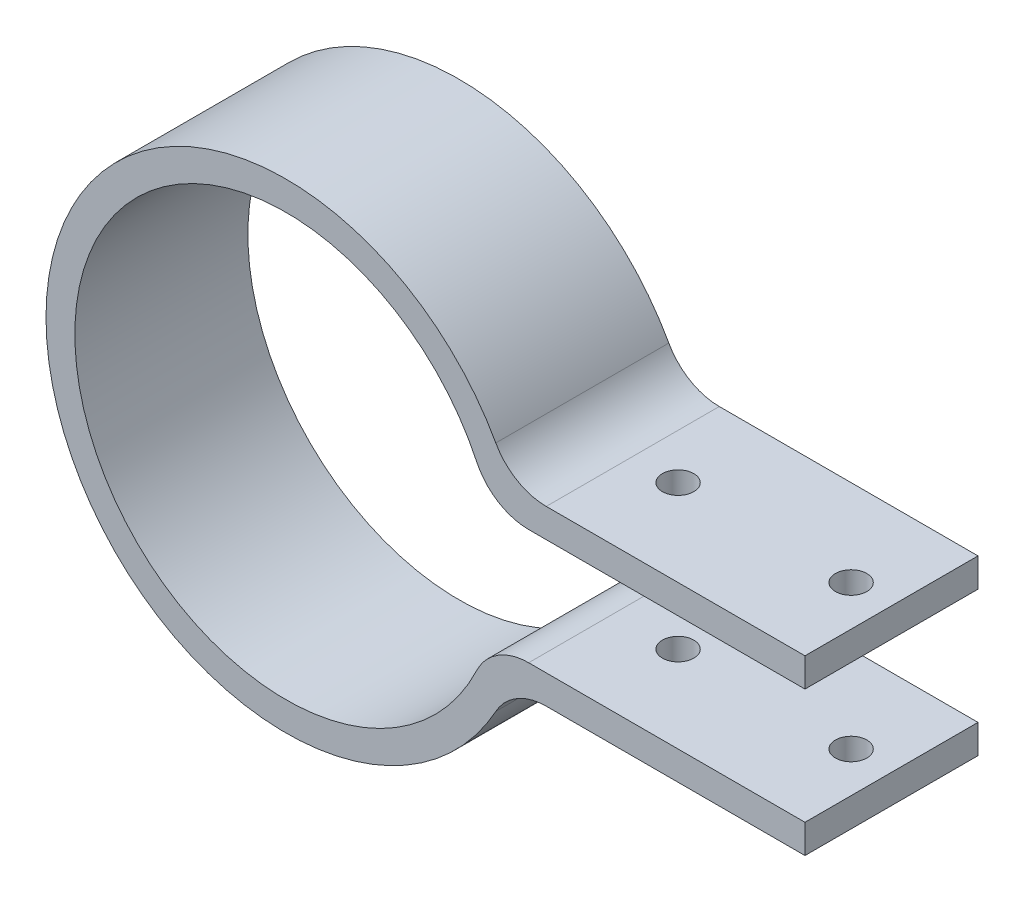
ISO-10303-21;
HEADER;
FILE_DESCRIPTION(('STEP AP214'),'2;1');
FILE_NAME('part.step','',(''),(''),'','','');
FILE_SCHEMA(('AUTOMOTIVE_DESIGN { 1 0 10303 214 1 1 1 1 }'));
ENDSEC;
DATA;
#1=APPLICATION_CONTEXT('core data for automotive mechanical design processes');
#2=APPLICATION_PROTOCOL_DEFINITION('international standard','automotive_design',2000,#1);
#3=PRODUCT_CONTEXT('',#1,'mechanical');
#4=PRODUCT('Part','Part','',(#3));
#5=PRODUCT_RELATED_PRODUCT_CATEGORY('part','',(#4));
#6=PRODUCT_DEFINITION_FORMATION('','',#4);
#7=PRODUCT_DEFINITION_CONTEXT('part definition',#1,'design');
#8=PRODUCT_DEFINITION('design','',#6,#7);
#9=PRODUCT_DEFINITION_SHAPE('','',#8);
#10=(LENGTH_UNIT() NAMED_UNIT(*) SI_UNIT(.MILLI.,.METRE.));
#11=(NAMED_UNIT(*) PLANE_ANGLE_UNIT() SI_UNIT($,.RADIAN.));
#12=(NAMED_UNIT(*) SI_UNIT($,.STERADIAN.) SOLID_ANGLE_UNIT());
#13=UNCERTAINTY_MEASURE_WITH_UNIT(LENGTH_MEASURE(1.E-05),#10,'distance_accuracy_value','');
#14=(GEOMETRIC_REPRESENTATION_CONTEXT(3) GLOBAL_UNCERTAINTY_ASSIGNED_CONTEXT((#13)) GLOBAL_UNIT_ASSIGNED_CONTEXT((#10,
#11,#12)) REPRESENTATION_CONTEXT('',''));
#15=CARTESIAN_POINT('',(0.,0.,0.));
#16=DIRECTION('',(0.,0.,1.));
#17=DIRECTION('',(1.,0.,0.));
#18=AXIS2_PLACEMENT_3D('',#15,#16,#17);
#19=CARTESIAN_POINT('',(0.,6.35,19.05));
#20=DIRECTION('',(0.,1.,0.));
#21=DIRECTION('',(0.,0.,1.));
#22=AXIS2_PLACEMENT_3D('',#19,#20,#21);
#23=PLANE('',#22);
#24=CARTESIAN_POINT('',(33.655,6.35,9.525));
#25=DIRECTION('',(0.,1.,0.));
#26=DIRECTION('',(0.,0.,1.));
#27=AXIS2_PLACEMENT_3D('',#24,#25,#26);
#28=CIRCLE('',#27,1.72719999999999);
#29=CARTESIAN_POINT('',(33.655,6.35,11.2522));
#30=VERTEX_POINT('',#29);
#31=EDGE_CURVE('E229',#30,#30,#28,.T.);
#32=ORIENTED_EDGE('',*,*,#31,.T.);
#33=EDGE_LOOP('',(#32));
#34=FACE_BOUND('',#33,.T.);
#35=CARTESIAN_POINT('',(52.705,6.35,9.525));
#36=DIRECTION('',(0.,1.,0.));
#37=DIRECTION('',(0.,0.,1.));
#38=AXIS2_PLACEMENT_3D('',#35,#36,#37);
#39=CIRCLE('',#38,1.72719999999999);
#40=CARTESIAN_POINT('',(52.705,6.35,11.2522));
#41=VERTEX_POINT('',#40);
#42=EDGE_CURVE('E170',#41,#41,#39,.T.);
#43=ORIENTED_EDGE('',*,*,#42,.T.);
#44=EDGE_LOOP('',(#43));
#45=FACE_BOUND('',#44,.T.);
#46=DIRECTION('',(1.,0.,0.));
#47=VECTOR('',#46,1.);
#48=CARTESIAN_POINT('',(0.,6.35,19.05));
#49=LINE('',#48,#47);
#50=CARTESIAN_POINT('',(26.7270888987185,6.35,19.05));
#51=VERTEX_POINT('',#50);
#52=CARTESIAN_POINT('',(57.15,6.35,19.05));
#53=VERTEX_POINT('',#52);
#54=EDGE_CURVE('E126',#51,#53,#49,.T.);
#55=ORIENTED_EDGE('',*,*,#54,.F.);
#56=DIRECTION('',(0.,0.,1.));
#57=VECTOR('',#56,1.);
#58=CARTESIAN_POINT('',(26.7270888987185,6.35,0.));
#59=LINE('',#58,#57);
#60=CARTESIAN_POINT('',(26.7270888987185,6.35,0.));
#61=VERTEX_POINT('',#60);
#62=EDGE_CURVE('E214',#51,#61,#59,.F.);
#63=ORIENTED_EDGE('',*,*,#62,.T.);
#64=DIRECTION('',(1.,0.,0.));
#65=VECTOR('',#64,1.);
#66=CARTESIAN_POINT('',(0.,6.35,0.));
#67=LINE('',#66,#65);
#68=CARTESIAN_POINT('',(57.15,6.35,0.));
#69=VERTEX_POINT('',#68);
#70=EDGE_CURVE('E140',#61,#69,#67,.T.);
#71=ORIENTED_EDGE('',*,*,#70,.T.);
#72=DIRECTION('',(0.,0.,-1.));
#73=VECTOR('',#72,1.);
#74=CARTESIAN_POINT('',(57.15,6.35,19.05));
#75=LINE('',#74,#73);
#76=EDGE_CURVE('E138',#53,#69,#75,.T.);
#77=ORIENTED_EDGE('',*,*,#76,.F.);
#78=EDGE_LOOP('',(#55,#63,#71,#77));
#79=FACE_BOUND('',#78,.T.);
#80=ADVANCED_FACE('F35',(#34,#45,#79),#23,.F.);
#81=CARTESIAN_POINT('',(57.15,0.,19.05));
#82=DIRECTION('',(1.,0.,0.));
#83=DIRECTION('',(0.,0.,-1.));
#84=AXIS2_PLACEMENT_3D('',#81,#82,#83);
#85=PLANE('',#84);
#86=DIRECTION('',(0.,-1.,0.));
#87=VECTOR('',#86,1.);
#88=CARTESIAN_POINT('',(57.15,0.,0.));
#89=LINE('',#88,#87);
#90=CARTESIAN_POINT('',(57.15,9.525,0.));
#91=VERTEX_POINT('',#90);
#92=EDGE_CURVE('E169',#91,#69,#89,.T.);
#93=ORIENTED_EDGE('',*,*,#92,.F.);
#94=DIRECTION('',(0.,0.,-1.));
#95=VECTOR('',#94,1.);
#96=CARTESIAN_POINT('',(57.15,9.525,19.05));
#97=LINE('',#96,#95);
#98=CARTESIAN_POINT('',(57.15,9.525,19.05));
#99=VERTEX_POINT('',#98);
#100=EDGE_CURVE('E145',#99,#91,#97,.T.);
#101=ORIENTED_EDGE('',*,*,#100,.F.);
#102=DIRECTION('',(0.,-1.,0.));
#103=VECTOR('',#102,1.);
#104=CARTESIAN_POINT('',(57.15,0.,19.05));
#105=LINE('',#104,#103);
#106=EDGE_CURVE('E131',#99,#53,#105,.T.);
#107=ORIENTED_EDGE('',*,*,#106,.T.);
#108=ORIENTED_EDGE('',*,*,#76,.T.);
#109=EDGE_LOOP('',(#93,#101,#107,#108));
#110=FACE_BOUND('',#109,.T.);
#111=ADVANCED_FACE('F147',(#110),#85,.T.);
#112=CARTESIAN_POINT('',(0.,9.52500000000001,19.05));
#113=DIRECTION('',(0.,-1.,0.));
#114=DIRECTION('',(1.,0.,0.));
#115=AXIS2_PLACEMENT_3D('',#112,#113,#114);
#116=PLANE('',#115);
#117=CARTESIAN_POINT('',(33.655,9.525,9.525));
#118=DIRECTION('',(0.,1.,0.));
#119=DIRECTION('',(0.,0.,1.));
#120=AXIS2_PLACEMENT_3D('',#117,#118,#119);
#121=CIRCLE('',#120,1.7272);
#122=CARTESIAN_POINT('',(33.655,9.525,11.2522));
#123=VERTEX_POINT('',#122);
#124=EDGE_CURVE('E411',#123,#123,#121,.T.);
#125=ORIENTED_EDGE('',*,*,#124,.F.);
#126=EDGE_LOOP('',(#125));
#127=FACE_BOUND('',#126,.T.);
#128=CARTESIAN_POINT('',(52.705,9.525,9.525));
#129=DIRECTION('',(0.,1.,0.));
#130=DIRECTION('',(0.,0.,1.));
#131=AXIS2_PLACEMENT_3D('',#128,#129,#130);
#132=CIRCLE('',#131,1.7272);
#133=CARTESIAN_POINT('',(52.705,9.525,11.2522));
#134=VERTEX_POINT('',#133);
#135=EDGE_CURVE('E223',#134,#134,#132,.T.);
#136=ORIENTED_EDGE('',*,*,#135,.F.);
#137=EDGE_LOOP('',(#136));
#138=FACE_BOUND('',#137,.T.);
#139=DIRECTION('',(-1.,0.,0.));
#140=VECTOR('',#139,1.);
#141=CARTESIAN_POINT('',(0.,9.52500000000001,0.));
#142=LINE('',#141,#140);
#143=CARTESIAN_POINT('',(28.6634807900227,9.525,0.));
#144=VERTEX_POINT('',#143);
#145=EDGE_CURVE('E172',#91,#144,#142,.T.);
#146=ORIENTED_EDGE('',*,*,#145,.T.);
#147=DIRECTION('',(0.,0.,1.));
#148=VECTOR('',#147,1.);
#149=CARTESIAN_POINT('',(28.6634807900227,9.525,19.05));
#150=LINE('',#149,#148);
#151=CARTESIAN_POINT('',(28.6634807900227,9.525,19.05));
#152=VERTEX_POINT('',#151);
#153=EDGE_CURVE('E52',#144,#152,#150,.T.);
#154=ORIENTED_EDGE('',*,*,#153,.T.);
#155=DIRECTION('',(-1.,0.,0.));
#156=VECTOR('',#155,1.);
#157=CARTESIAN_POINT('',(0.,9.52500000000001,19.05));
#158=LINE('',#157,#156);
#159=EDGE_CURVE('E148',#99,#152,#158,.T.);
#160=ORIENTED_EDGE('',*,*,#159,.F.);
#161=ORIENTED_EDGE('',*,*,#100,.T.);
#162=EDGE_LOOP('',(#146,#154,#160,#161));
#163=FACE_BOUND('',#162,.T.);
#164=ADVANCED_FACE('F261',(#127,#138,#163),#116,.F.);
#165=CARTESIAN_POINT('',(0.,0.,19.05));
#166=DIRECTION('',(0.,0.,-1.));
#167=DIRECTION('',(-1.,0.,0.));
#168=AXIS2_PLACEMENT_3D('',#165,#166,#167);
#169=CYLINDRICAL_SURFACE('',#168,26.416);
#170=CARTESIAN_POINT('',(0.,0.,0.));
#171=DIRECTION('',(0.,0.,1.));
#172=DIRECTION('',(1.,0.,0.));
#173=AXIS2_PLACEMENT_3D('',#170,#171,#172);
#174=CIRCLE('',#173,26.416);
#175=CARTESIAN_POINT('',(23.1085426524214,12.7984496124031,0.));
#176=VERTEX_POINT('',#175);
#177=CARTESIAN_POINT('',(23.1085426524214,-12.7984496124031,0.));
#178=VERTEX_POINT('',#177);
#179=EDGE_CURVE('E174',#176,#178,#174,.T.);
#180=ORIENTED_EDGE('',*,*,#179,.T.);
#181=DIRECTION('',(0.,0.,-1.));
#182=VECTOR('',#181,1.);
#183=CARTESIAN_POINT('',(23.1085426524214,-12.7984496124031,19.05));
#184=LINE('',#183,#182);
#185=CARTESIAN_POINT('',(23.1085426524214,-12.7984496124031,19.05));
#186=VERTEX_POINT('',#185);
#187=EDGE_CURVE('E197',#178,#186,#184,.F.);
#188=ORIENTED_EDGE('',*,*,#187,.T.);
#189=CARTESIAN_POINT('',(0.,0.,19.05));
#190=DIRECTION('',(0.,0.,1.));
#191=DIRECTION('',(1.,0.,0.));
#192=AXIS2_PLACEMENT_3D('',#189,#190,#191);
#193=CIRCLE('',#192,26.416);
#194=CARTESIAN_POINT('',(23.1085426524214,12.7984496124031,19.05));
#195=VERTEX_POINT('',#194);
#196=EDGE_CURVE('E150',#195,#186,#193,.T.);
#197=ORIENTED_EDGE('',*,*,#196,.F.);
#198=DIRECTION('',(0.,0.,-1.));
#199=VECTOR('',#198,1.);
#200=CARTESIAN_POINT('',(23.1085426524214,12.7984496124031,19.05));
#201=LINE('',#200,#199);
#202=EDGE_CURVE('E194',#195,#176,#201,.T.);
#203=ORIENTED_EDGE('',*,*,#202,.T.);
#204=EDGE_LOOP('',(#180,#188,#197,#203));
#205=FACE_BOUND('',#204,.T.);
#206=ADVANCED_FACE('F285',(#205),#169,.T.);
#207=CARTESIAN_POINT('',(0.,-9.52500000000001,19.05));
#208=DIRECTION('',(0.,-1.,0.));
#209=DIRECTION('',(1.,0.,0.));
#210=AXIS2_PLACEMENT_3D('',#207,#208,#209);
#211=PLANE('',#210);
#212=CARTESIAN_POINT('',(33.655,-9.525,9.525));
#213=DIRECTION('',(0.,-1.,0.));
#214=DIRECTION('',(1.,0.,0.));
#215=AXIS2_PLACEMENT_3D('',#212,#213,#214);
#216=CIRCLE('',#215,1.72719999999999);
#217=CARTESIAN_POINT('',(33.655,-9.525,11.2522));
#218=VERTEX_POINT('',#217);
#219=EDGE_CURVE('E234',#218,#218,#216,.T.);
#220=ORIENTED_EDGE('',*,*,#219,.F.);
#221=EDGE_LOOP('',(#220));
#222=FACE_BOUND('',#221,.T.);
#223=CARTESIAN_POINT('',(52.705,-9.525,9.525));
#224=DIRECTION('',(0.,-1.,0.));
#225=DIRECTION('',(1.,0.,0.));
#226=AXIS2_PLACEMENT_3D('',#223,#224,#225);
#227=CIRCLE('',#226,1.72719999999999);
#228=CARTESIAN_POINT('',(52.705,-9.525,11.2522));
#229=VERTEX_POINT('',#228);
#230=EDGE_CURVE('E222',#229,#229,#227,.T.);
#231=ORIENTED_EDGE('',*,*,#230,.F.);
#232=EDGE_LOOP('',(#231));
#233=FACE_BOUND('',#232,.T.);
#234=DIRECTION('',(-1.,0.,0.));
#235=VECTOR('',#234,1.);
#236=CARTESIAN_POINT('',(0.,-9.52500000000001,19.05));
#237=LINE('',#236,#235);
#238=CARTESIAN_POINT('',(57.15,-9.525,19.05));
#239=VERTEX_POINT('',#238);
#240=CARTESIAN_POINT('',(28.6634807900227,-9.525,19.05));
#241=VERTEX_POINT('',#240);
#242=EDGE_CURVE('E156',#239,#241,#237,.T.);
#243=ORIENTED_EDGE('',*,*,#242,.T.);
#244=DIRECTION('',(0.,0.,-1.));
#245=VECTOR('',#244,1.);
#246=CARTESIAN_POINT('',(28.6634807900227,-9.525,19.05));
#247=LINE('',#246,#245);
#248=CARTESIAN_POINT('',(28.6634807900227,-9.525,0.));
#249=VERTEX_POINT('',#248);
#250=EDGE_CURVE('E144',#241,#249,#247,.T.);
#251=ORIENTED_EDGE('',*,*,#250,.T.);
#252=DIRECTION('',(-1.,0.,0.));
#253=VECTOR('',#252,1.);
#254=CARTESIAN_POINT('',(0.,-9.52500000000001,0.));
#255=LINE('',#254,#253);
#256=CARTESIAN_POINT('',(57.15,-9.525,0.));
#257=VERTEX_POINT('',#256);
#258=EDGE_CURVE('E177',#257,#249,#255,.T.);
#259=ORIENTED_EDGE('',*,*,#258,.F.);
#260=DIRECTION('',(0.,0.,-1.));
#261=VECTOR('',#260,1.);
#262=CARTESIAN_POINT('',(57.15,-9.525,19.05));
#263=LINE('',#262,#261);
#264=EDGE_CURVE('E189',#239,#257,#263,.T.);
#265=ORIENTED_EDGE('',*,*,#264,.F.);
#266=EDGE_LOOP('',(#243,#251,#259,#265));
#267=FACE_BOUND('',#266,.T.);
#268=ADVANCED_FACE('F292',(#222,#233,#267),#211,.T.);
#269=CARTESIAN_POINT('',(57.15,0.,19.05));
#270=DIRECTION('',(1.,0.,0.));
#271=DIRECTION('',(0.,0.,-1.));
#272=AXIS2_PLACEMENT_3D('',#269,#270,#271);
#273=PLANE('',#272);
#274=DIRECTION('',(0.,-1.,0.));
#275=VECTOR('',#274,1.);
#276=CARTESIAN_POINT('',(57.15,0.,0.));
#277=LINE('',#276,#275);
#278=CARTESIAN_POINT('',(57.15,-6.35,0.));
#279=VERTEX_POINT('',#278);
#280=EDGE_CURVE('E180',#279,#257,#277,.T.);
#281=ORIENTED_EDGE('',*,*,#280,.F.);
#282=DIRECTION('',(0.,0.,-1.));
#283=VECTOR('',#282,1.);
#284=CARTESIAN_POINT('',(57.15,-6.35,19.05));
#285=LINE('',#284,#283);
#286=CARTESIAN_POINT('',(57.15,-6.35,19.05));
#287=VERTEX_POINT('',#286);
#288=EDGE_CURVE('E167',#287,#279,#285,.T.);
#289=ORIENTED_EDGE('',*,*,#288,.F.);
#290=DIRECTION('',(0.,-1.,0.));
#291=VECTOR('',#290,1.);
#292=CARTESIAN_POINT('',(57.15,0.,19.05));
#293=LINE('',#292,#291);
#294=EDGE_CURVE('E159',#287,#239,#293,.T.);
#295=ORIENTED_EDGE('',*,*,#294,.T.);
#296=ORIENTED_EDGE('',*,*,#264,.T.);
#297=EDGE_LOOP('',(#281,#289,#295,#296));
#298=FACE_BOUND('',#297,.T.);
#299=ADVANCED_FACE('F296',(#298),#273,.T.);
#300=CARTESIAN_POINT('',(0.,-6.35000000000001,19.05));
#301=DIRECTION('',(0.,-1.,0.));
#302=DIRECTION('',(1.,0.,0.));
#303=AXIS2_PLACEMENT_3D('',#300,#301,#302);
#304=PLANE('',#303);
#305=CARTESIAN_POINT('',(33.655,-6.35,9.525));
#306=DIRECTION('',(0.,-1.,0.));
#307=DIRECTION('',(1.,0.,0.));
#308=AXIS2_PLACEMENT_3D('',#305,#306,#307);
#309=CIRCLE('',#308,1.72719999999999);
#310=CARTESIAN_POINT('',(33.655,-6.35,11.2522));
#311=VERTEX_POINT('',#310);
#312=EDGE_CURVE('E39',#311,#311,#309,.T.);
#313=ORIENTED_EDGE('',*,*,#312,.T.);
#314=EDGE_LOOP('',(#313));
#315=FACE_BOUND('',#314,.T.);
#316=CARTESIAN_POINT('',(52.705,-6.35,9.525));
#317=DIRECTION('',(0.,-1.,0.));
#318=DIRECTION('',(1.,0.,0.));
#319=AXIS2_PLACEMENT_3D('',#316,#317,#318);
#320=CIRCLE('',#319,1.72719999999999);
#321=CARTESIAN_POINT('',(52.705,-6.35,11.2522));
#322=VERTEX_POINT('',#321);
#323=EDGE_CURVE('E220',#322,#322,#320,.T.);
#324=ORIENTED_EDGE('',*,*,#323,.T.);
#325=EDGE_LOOP('',(#324));
#326=FACE_BOUND('',#325,.T.);
#327=DIRECTION('',(-1.,0.,0.));
#328=VECTOR('',#327,1.);
#329=CARTESIAN_POINT('',(0.,-6.35000000000001,0.));
#330=LINE('',#329,#328);
#331=CARTESIAN_POINT('',(26.7270888987185,-6.35,0.));
#332=VERTEX_POINT('',#331);
#333=EDGE_CURVE('E183',#279,#332,#330,.T.);
#334=ORIENTED_EDGE('',*,*,#333,.T.);
#335=DIRECTION('',(0.,0.,1.));
#336=VECTOR('',#335,1.);
#337=CARTESIAN_POINT('',(26.7270888987185,-6.35,19.05));
#338=LINE('',#337,#336);
#339=CARTESIAN_POINT('',(26.7270888987185,-6.35,19.05));
#340=VERTEX_POINT('',#339);
#341=EDGE_CURVE('E208',#332,#340,#338,.T.);
#342=ORIENTED_EDGE('',*,*,#341,.T.);
#343=DIRECTION('',(-1.,0.,0.));
#344=VECTOR('',#343,1.);
#345=CARTESIAN_POINT('',(0.,-6.35000000000001,19.05));
#346=LINE('',#345,#344);
#347=EDGE_CURVE('E162',#287,#340,#346,.T.);
#348=ORIENTED_EDGE('',*,*,#347,.F.);
#349=ORIENTED_EDGE('',*,*,#288,.T.);
#350=EDGE_LOOP('',(#334,#342,#348,#349));
#351=FACE_BOUND('',#350,.T.);
#352=ADVANCED_FACE('F323',(#315,#326,#351),#304,.F.);
#353=CARTESIAN_POINT('',(0.,0.,19.05));
#354=DIRECTION('',(0.,0.,-1.));
#355=DIRECTION('',(-1.,0.,0.));
#356=AXIS2_PLACEMENT_3D('',#353,#354,#355);
#357=CYLINDRICAL_SURFACE('',#356,23.241);
#358=CARTESIAN_POINT('',(0.,0.,19.05));
#359=DIRECTION('',(0.,0.,1.));
#360=DIRECTION('',(1.,0.,0.));
#361=AXIS2_PLACEMENT_3D('',#358,#359,#360);
#362=CIRCLE('',#361,23.241);
#363=CARTESIAN_POINT('',(20.9916620964184,9.97467811158798,19.05));
#364=VERTEX_POINT('',#363);
#365=CARTESIAN_POINT('',(20.9916620964184,-9.97467811158799,19.05));
#366=VERTEX_POINT('',#365);
#367=EDGE_CURVE('E164',#364,#366,#362,.T.);
#368=ORIENTED_EDGE('',*,*,#367,.T.);
#369=DIRECTION('',(0.,0.,-1.));
#370=VECTOR('',#369,1.);
#371=CARTESIAN_POINT('',(20.9916620964184,-9.97467811158798,19.05));
#372=LINE('',#371,#370);
#373=CARTESIAN_POINT('',(20.9916620964184,-9.97467811158799,0.));
#374=VERTEX_POINT('',#373);
#375=EDGE_CURVE('E201',#366,#374,#372,.T.);
#376=ORIENTED_EDGE('',*,*,#375,.T.);
#377=CARTESIAN_POINT('',(0.,0.,0.));
#378=DIRECTION('',(0.,0.,1.));
#379=DIRECTION('',(1.,0.,0.));
#380=AXIS2_PLACEMENT_3D('',#377,#378,#379);
#381=CIRCLE('',#380,23.241);
#382=CARTESIAN_POINT('',(20.9916620964184,9.97467811158798,0.));
#383=VERTEX_POINT('',#382);
#384=EDGE_CURVE('E135',#383,#374,#381,.T.);
#385=ORIENTED_EDGE('',*,*,#384,.F.);
#386=DIRECTION('',(0.,0.,-1.));
#387=VECTOR('',#386,1.);
#388=CARTESIAN_POINT('',(20.9916620964184,9.97467811158798,19.05));
#389=LINE('',#388,#387);
#390=EDGE_CURVE('E199',#383,#364,#389,.F.);
#391=ORIENTED_EDGE('',*,*,#390,.T.);
#392=EDGE_LOOP('',(#368,#376,#385,#391));
#393=FACE_BOUND('',#392,.T.);
#394=ADVANCED_FACE('F304',(#393),#357,.F.);
#395=CARTESIAN_POINT('',(0.,0.,19.05));
#396=DIRECTION('',(0.,0.,1.));
#397=DIRECTION('',(1.,0.,0.));
#398=AXIS2_PLACEMENT_3D('',#395,#396,#397);
#399=PLANE('',#398);
#400=ORIENTED_EDGE('',*,*,#347,.T.);
#401=CARTESIAN_POINT('',(26.7270888987185,-12.7,19.05));
#402=DIRECTION('',(0.,0.,1.));
#403=DIRECTION('',(1.,0.,0.));
#404=AXIS2_PLACEMENT_3D('',#401,#402,#403);
#405=CIRCLE('',#404,6.35);
#406=EDGE_CURVE('E211',#340,#366,#405,.T.);
#407=ORIENTED_EDGE('',*,*,#406,.T.);
#408=ORIENTED_EDGE('',*,*,#367,.F.);
#409=CARTESIAN_POINT('',(26.7270888987185,12.7,19.05));
#410=DIRECTION('',(0.,0.,1.));
#411=DIRECTION('',(1.,0.,0.));
#412=AXIS2_PLACEMENT_3D('',#409,#410,#411);
#413=CIRCLE('',#412,6.35);
#414=EDGE_CURVE('E60',#364,#51,#413,.T.);
#415=ORIENTED_EDGE('',*,*,#414,.T.);
#416=ORIENTED_EDGE('',*,*,#54,.T.);
#417=ORIENTED_EDGE('',*,*,#106,.F.);
#418=ORIENTED_EDGE('',*,*,#159,.T.);
#419=CARTESIAN_POINT('',(28.6634807900227,15.875,19.05));
#420=DIRECTION('',(0.,0.,1.));
#421=DIRECTION('',(1.,0.,0.));
#422=AXIS2_PLACEMENT_3D('',#419,#420,#421);
#423=CIRCLE('',#422,6.35);
#424=EDGE_CURVE('E11',#152,#195,#423,.F.);
#425=ORIENTED_EDGE('',*,*,#424,.T.);
#426=ORIENTED_EDGE('',*,*,#196,.T.);
#427=CARTESIAN_POINT('',(28.6634807900227,-15.875,19.05));
#428=DIRECTION('',(0.,0.,1.));
#429=DIRECTION('',(1.,0.,0.));
#430=AXIS2_PLACEMENT_3D('',#427,#428,#429);
#431=CIRCLE('',#430,6.35);
#432=EDGE_CURVE('E218',#186,#241,#431,.F.);
#433=ORIENTED_EDGE('',*,*,#432,.T.);
#434=ORIENTED_EDGE('',*,*,#242,.F.);
#435=ORIENTED_EDGE('',*,*,#294,.F.);
#436=EDGE_LOOP('',(#400,#407,#408,#415,#416,#417,#418,#425,#426,#433,#434,#435));
#437=FACE_BOUND('',#436,.T.);
#438=ADVANCED_FACE('F129',(#437),#399,.T.);
#439=CARTESIAN_POINT('',(0.,0.,0.));
#440=DIRECTION('',(0.,0.,1.));
#441=DIRECTION('',(1.,0.,0.));
#442=AXIS2_PLACEMENT_3D('',#439,#440,#441);
#443=PLANE('',#442);
#444=ORIENTED_EDGE('',*,*,#384,.T.);
#445=CARTESIAN_POINT('',(26.7270888987185,-12.7,0.));
#446=DIRECTION('',(0.,0.,1.));
#447=DIRECTION('',(1.,0.,0.));
#448=AXIS2_PLACEMENT_3D('',#445,#446,#447);
#449=CIRCLE('',#448,6.35);
#450=EDGE_CURVE('E206',#374,#332,#449,.F.);
#451=ORIENTED_EDGE('',*,*,#450,.T.);
#452=ORIENTED_EDGE('',*,*,#333,.F.);
#453=ORIENTED_EDGE('',*,*,#280,.T.);
#454=ORIENTED_EDGE('',*,*,#258,.T.);
#455=CARTESIAN_POINT('',(28.6634807900227,-15.875,0.));
#456=DIRECTION('',(0.,0.,1.));
#457=DIRECTION('',(1.,0.,0.));
#458=AXIS2_PLACEMENT_3D('',#455,#456,#457);
#459=CIRCLE('',#458,6.35);
#460=EDGE_CURVE('E216',#249,#178,#459,.T.);
#461=ORIENTED_EDGE('',*,*,#460,.T.);
#462=ORIENTED_EDGE('',*,*,#179,.F.);
#463=CARTESIAN_POINT('',(28.6634807900227,15.875,0.));
#464=DIRECTION('',(0.,0.,1.));
#465=DIRECTION('',(1.,0.,0.));
#466=AXIS2_PLACEMENT_3D('',#463,#464,#465);
#467=CIRCLE('',#466,6.35);
#468=EDGE_CURVE('E44',#176,#144,#467,.T.);
#469=ORIENTED_EDGE('',*,*,#468,.T.);
#470=ORIENTED_EDGE('',*,*,#145,.F.);
#471=ORIENTED_EDGE('',*,*,#92,.T.);
#472=ORIENTED_EDGE('',*,*,#70,.F.);
#473=CARTESIAN_POINT('',(26.7270888987185,12.7,0.));
#474=DIRECTION('',(0.,0.,1.));
#475=DIRECTION('',(1.,0.,0.));
#476=AXIS2_PLACEMENT_3D('',#473,#474,#475);
#477=CIRCLE('',#476,6.35);
#478=EDGE_CURVE('E204',#61,#383,#477,.F.);
#479=ORIENTED_EDGE('',*,*,#478,.T.);
#480=EDGE_LOOP('',(#444,#451,#452,#453,#454,#461,#462,#469,#470,#471,#472,#479));
#481=FACE_BOUND('',#480,.T.);
#482=ADVANCED_FACE('F269',(#481),#443,.F.);
#483=CARTESIAN_POINT('',(28.6634807900227,-15.875,19.05));
#484=DIRECTION('',(0.,0.,-1.));
#485=DIRECTION('',(-1.,0.,0.));
#486=AXIS2_PLACEMENT_3D('',#483,#484,#485);
#487=CYLINDRICAL_SURFACE('',#486,6.35);
#488=ORIENTED_EDGE('',*,*,#432,.F.);
#489=ORIENTED_EDGE('',*,*,#187,.F.);
#490=ORIENTED_EDGE('',*,*,#460,.F.);
#491=ORIENTED_EDGE('',*,*,#250,.F.);
#492=EDGE_LOOP('',(#488,#489,#490,#491));
#493=FACE_BOUND('',#492,.T.);
#494=ADVANCED_FACE('F265',(#493),#487,.F.);
#495=CARTESIAN_POINT('',(26.7270888987185,-12.7,19.05));
#496=DIRECTION('',(0.,0.,-1.));
#497=DIRECTION('',(-1.,0.,0.));
#498=AXIS2_PLACEMENT_3D('',#495,#496,#497);
#499=CYLINDRICAL_SURFACE('',#498,6.35);
#500=ORIENTED_EDGE('',*,*,#406,.F.);
#501=ORIENTED_EDGE('',*,*,#341,.F.);
#502=ORIENTED_EDGE('',*,*,#450,.F.);
#503=ORIENTED_EDGE('',*,*,#375,.F.);
#504=EDGE_LOOP('',(#500,#501,#502,#503));
#505=FACE_BOUND('',#504,.T.);
#506=ADVANCED_FACE('F268',(#505),#499,.T.);
#507=CARTESIAN_POINT('',(28.6634807900227,15.875,19.05));
#508=DIRECTION('',(0.,0.,-1.));
#509=DIRECTION('',(-1.,0.,0.));
#510=AXIS2_PLACEMENT_3D('',#507,#508,#509);
#511=CYLINDRICAL_SURFACE('',#510,6.35);
#512=ORIENTED_EDGE('',*,*,#424,.F.);
#513=ORIENTED_EDGE('',*,*,#153,.F.);
#514=ORIENTED_EDGE('',*,*,#468,.F.);
#515=ORIENTED_EDGE('',*,*,#202,.F.);
#516=EDGE_LOOP('',(#512,#513,#514,#515));
#517=FACE_BOUND('',#516,.T.);
#518=ADVANCED_FACE('F272',(#517),#511,.F.);
#519=CARTESIAN_POINT('',(26.7270888987185,12.7,19.05));
#520=DIRECTION('',(0.,0.,-1.));
#521=DIRECTION('',(-1.,0.,0.));
#522=AXIS2_PLACEMENT_3D('',#519,#520,#521);
#523=CYLINDRICAL_SURFACE('',#522,6.35);
#524=ORIENTED_EDGE('',*,*,#414,.F.);
#525=ORIENTED_EDGE('',*,*,#390,.F.);
#526=ORIENTED_EDGE('',*,*,#478,.F.);
#527=ORIENTED_EDGE('',*,*,#62,.F.);
#528=EDGE_LOOP('',(#524,#525,#526,#527));
#529=FACE_BOUND('',#528,.T.);
#530=ADVANCED_FACE('F37',(#529),#523,.T.);
#531=CARTESIAN_POINT('',(52.705,9.525,9.525));
#532=DIRECTION('',(0.,1.,0.));
#533=DIRECTION('',(0.,0.,1.));
#534=AXIS2_PLACEMENT_3D('',#531,#532,#533);
#535=CYLINDRICAL_SURFACE('',#534,1.72719999999999);
#536=CARTESIAN_POINT('',(52.705,-9.525,11.2522));
#537=CARTESIAN_POINT('',(52.705,-9.49192708333333,11.2522));
#538=CARTESIAN_POINT('',(52.705,-9.45885416666666,11.2522));
#539=CARTESIAN_POINT('',(52.705,-9.39270833333333,11.2522));
#540=CARTESIAN_POINT('',(52.705,-9.35963541666666,11.2522));
#541=CARTESIAN_POINT('',(52.705,-9.29348958333333,11.2522));
#542=CARTESIAN_POINT('',(52.705,-9.26041666666666,11.2522));
#543=CARTESIAN_POINT('',(52.705,-9.19427083333333,11.2522));
#544=CARTESIAN_POINT('',(52.705,-9.16119791666667,11.2522));
#545=CARTESIAN_POINT('',(52.705,-9.09505208333333,11.2522));
#546=CARTESIAN_POINT('',(52.705,-9.06197916666666,11.2522));
#547=CARTESIAN_POINT('',(52.705,-8.99583333333333,11.2522));
#548=CARTESIAN_POINT('',(52.705,-8.96276041666666,11.2522));
#549=CARTESIAN_POINT('',(52.705,-8.89661458333333,11.2522));
#550=CARTESIAN_POINT('',(52.705,-8.86354166666666,11.2522));
#551=CARTESIAN_POINT('',(52.705,-8.79739583333333,11.2522));
#552=CARTESIAN_POINT('',(52.705,-8.76432291666666,11.2522));
#553=CARTESIAN_POINT('',(52.705,-8.69817708333333,11.2522));
#554=CARTESIAN_POINT('',(52.705,-8.66510416666666,11.2522));
#555=CARTESIAN_POINT('',(52.705,-8.59895833333333,11.2522));
#556=CARTESIAN_POINT('',(52.705,-8.56588541666667,11.2522));
#557=CARTESIAN_POINT('',(52.705,-8.49973958333333,11.2522));
#558=CARTESIAN_POINT('',(52.705,-8.46666666666666,11.2522));
#559=CARTESIAN_POINT('',(52.705,-8.40052083333333,11.2522));
#560=CARTESIAN_POINT('',(52.705,-8.36744791666666,11.2522));
#561=CARTESIAN_POINT('',(52.705,-8.30130208333333,11.2522));
#562=CARTESIAN_POINT('',(52.705,-8.26822916666666,11.2522));
#563=CARTESIAN_POINT('',(52.705,-8.20208333333333,11.2522));
#564=CARTESIAN_POINT('',(52.705,-8.16901041666666,11.2522));
#565=CARTESIAN_POINT('',(52.705,-8.10286458333333,11.2522));
#566=CARTESIAN_POINT('',(52.705,-8.06979166666667,11.2522));
#567=CARTESIAN_POINT('',(52.705,-8.00364583333333,11.2522));
#568=CARTESIAN_POINT('',(52.705,-7.97057291666667,11.2522));
#569=CARTESIAN_POINT('',(52.705,-7.90442708333333,11.2522));
#570=CARTESIAN_POINT('',(52.705,-7.87135416666666,11.2522));
#571=CARTESIAN_POINT('',(52.705,-7.80520833333333,11.2522));
#572=CARTESIAN_POINT('',(52.705,-7.77213541666667,11.2522));
#573=CARTESIAN_POINT('',(52.705,-7.70598958333333,11.2522));
#574=CARTESIAN_POINT('',(52.705,-7.67291666666667,11.2522));
#575=CARTESIAN_POINT('',(52.705,-7.60677083333333,11.2522));
#576=CARTESIAN_POINT('',(52.705,-7.57369791666667,11.2522));
#577=CARTESIAN_POINT('',(52.705,-7.50755208333333,11.2522));
#578=CARTESIAN_POINT('',(52.705,-7.47447916666667,11.2522));
#579=CARTESIAN_POINT('',(52.705,-7.40833333333333,11.2522));
#580=CARTESIAN_POINT('',(52.705,-7.37526041666667,11.2522));
#581=CARTESIAN_POINT('',(52.705,-7.30911458333333,11.2522));
#582=CARTESIAN_POINT('',(52.705,-7.27604166666667,11.2522));
#583=CARTESIAN_POINT('',(52.705,-7.20989583333333,11.2522));
#584=CARTESIAN_POINT('',(52.705,-7.17682291666667,11.2522));
#585=CARTESIAN_POINT('',(52.705,-7.11067708333333,11.2522));
#586=CARTESIAN_POINT('',(52.705,-7.07760416666667,11.2522));
#587=CARTESIAN_POINT('',(52.705,-7.01145833333333,11.2522));
#588=CARTESIAN_POINT('',(52.705,-6.97838541666667,11.2522));
#589=CARTESIAN_POINT('',(52.705,-6.91223958333333,11.2522));
#590=CARTESIAN_POINT('',(52.705,-6.87916666666667,11.2522));
#591=CARTESIAN_POINT('',(52.705,-6.81302083333333,11.2522));
#592=CARTESIAN_POINT('',(52.705,-6.77994791666667,11.2522));
#593=CARTESIAN_POINT('',(52.705,-6.71380208333333,11.2522));
#594=CARTESIAN_POINT('',(52.705,-6.68072916666667,11.2522));
#595=CARTESIAN_POINT('',(52.705,-6.61458333333333,11.2522));
#596=CARTESIAN_POINT('',(52.705,-6.58151041666667,11.2522));
#597=CARTESIAN_POINT('',(52.705,-6.51536458333333,11.2522));
#598=CARTESIAN_POINT('',(52.705,-6.48229166666667,11.2522));
#599=CARTESIAN_POINT('',(52.705,-6.41614583333333,11.2522));
#600=CARTESIAN_POINT('',(52.705,-6.38307291666667,11.2522));
#601=CARTESIAN_POINT('',(52.705,-6.35,11.2522));
#602=B_SPLINE_CURVE_WITH_KNOTS('',3,(#536,#537,#538,#539,#540,#541,#542,#543,#544,#545,#546,
#547,#548,#549,#550,#551,#552,#553,#554,#555,#556,#557,#558,#559,#560,#561,#562,#563,#564,#565,
#566,#567,#568,#569,#570,#571,#572,#573,#574,#575,#576,#577,#578,#579,#580,#581,#582,#583,#584,
#585,#586,#587,#588,#589,#590,#591,#592,#593,#594,#595,#596,#597,#598,#599,#600,#601),
.UNSPECIFIED.,.F.,.F.,(4,2,2,2,2,2,2,2,2,2,2,2,2,2,2,2,2,2,2,2,2,2,2,2,2,2,2,2,2,2,2,2,4),(0.,
0.0992187500000012,0.198437499999999,0.29765625,0.396874999999998,0.496093749999999,0.5953125,
0.694531249999998,0.793749999999999,0.892968750000001,0.992187499999998,1.09140625,1.190625,
1.28984375,1.3890625,1.48828125,1.5875,1.68671875,1.7859375,1.88515625,1.984375,2.08359375,
2.1828125,2.28203125,2.38125,2.48046875,2.5796875,2.67890625,2.778125,2.87734375,2.9765625,
3.07578125,3.175),.UNSPECIFIED.);
#603=EDGE_CURVE('BSEAM244',#229,#322,#602,.T.);
#604=ORIENTED_EDGE('',*,*,#230,.T.);
#605=ORIENTED_EDGE('',*,*,#323,.F.);
#606=ORIENTED_EDGE('',*,*,#603,.T.);
#607=ORIENTED_EDGE('',*,*,#603,.F.);
#608=EDGE_LOOP('',(#604,#606,#605,#607));
#609=FACE_BOUND('',#608,.T.);
#610=ADVANCED_FACE('F244',(#609),#535,.F.);
#611=ORIENTED_EDGE('',*,*,#135,.T.);
#612=EDGE_LOOP('',(#611));
#613=FACE_BOUND('',#612,.T.);
#614=ORIENTED_EDGE('',*,*,#42,.F.);
#615=EDGE_LOOP('',(#614));
#616=FACE_BOUND('',#615,.T.);
#617=ADVANCED_FACE('F241',(#613,#616),#535,.F.);
#618=CARTESIAN_POINT('',(33.655,9.525,9.525));
#619=DIRECTION('',(0.,1.,0.));
#620=DIRECTION('',(0.,0.,1.));
#621=AXIS2_PLACEMENT_3D('',#618,#619,#620);
#622=CYLINDRICAL_SURFACE('',#621,1.72719999999999);
#623=CARTESIAN_POINT('',(33.655,-9.525,11.2522));
#624=CARTESIAN_POINT('',(33.655,-9.49192708333334,11.2522));
#625=CARTESIAN_POINT('',(33.655,-9.45885416666667,11.2522));
#626=CARTESIAN_POINT('',(33.655,-9.39270833333333,11.2522));
#627=CARTESIAN_POINT('',(33.655,-9.35963541666667,11.2522));
#628=CARTESIAN_POINT('',(33.655,-9.29348958333334,11.2522));
#629=CARTESIAN_POINT('',(33.655,-9.26041666666667,11.2522));
#630=CARTESIAN_POINT('',(33.655,-9.19427083333334,11.2522));
#631=CARTESIAN_POINT('',(33.655,-9.16119791666667,11.2522));
#632=CARTESIAN_POINT('',(33.655,-9.09505208333333,11.2522));
#633=CARTESIAN_POINT('',(33.655,-9.06197916666667,11.2522));
#634=CARTESIAN_POINT('',(33.655,-8.99583333333334,11.2522));
#635=CARTESIAN_POINT('',(33.655,-8.96276041666667,11.2522));
#636=CARTESIAN_POINT('',(33.655,-8.89661458333333,11.2522));
#637=CARTESIAN_POINT('',(33.655,-8.86354166666667,11.2522));
#638=CARTESIAN_POINT('',(33.655,-8.79739583333333,11.2522));
#639=CARTESIAN_POINT('',(33.655,-8.76432291666667,11.2522));
#640=CARTESIAN_POINT('',(33.655,-8.69817708333333,11.2522));
#641=CARTESIAN_POINT('',(33.655,-8.66510416666667,11.2522));
#642=CARTESIAN_POINT('',(33.655,-8.59895833333334,11.2522));
#643=CARTESIAN_POINT('',(33.655,-8.56588541666667,11.2522));
#644=CARTESIAN_POINT('',(33.655,-8.49973958333333,11.2522));
#645=CARTESIAN_POINT('',(33.655,-8.46666666666667,11.2522));
#646=CARTESIAN_POINT('',(33.655,-8.40052083333333,11.2522));
#647=CARTESIAN_POINT('',(33.655,-8.36744791666667,11.2522));
#648=CARTESIAN_POINT('',(33.655,-8.30130208333333,11.2522));
#649=CARTESIAN_POINT('',(33.655,-8.26822916666667,11.2522));
#650=CARTESIAN_POINT('',(33.655,-8.20208333333333,11.2522));
#651=CARTESIAN_POINT('',(33.655,-8.16901041666667,11.2522));
#652=CARTESIAN_POINT('',(33.655,-8.10286458333333,11.2522));
#653=CARTESIAN_POINT('',(33.655,-8.06979166666667,11.2522));
#654=CARTESIAN_POINT('',(33.655,-8.00364583333334,11.2522));
#655=CARTESIAN_POINT('',(33.655,-7.97057291666667,11.2522));
#656=CARTESIAN_POINT('',(33.655,-7.90442708333333,11.2522));
#657=CARTESIAN_POINT('',(33.655,-7.87135416666667,11.2522));
#658=CARTESIAN_POINT('',(33.655,-7.80520833333333,11.2522));
#659=CARTESIAN_POINT('',(33.655,-7.77213541666667,11.2522));
#660=CARTESIAN_POINT('',(33.655,-7.70598958333333,11.2522));
#661=CARTESIAN_POINT('',(33.655,-7.67291666666667,11.2522));
#662=CARTESIAN_POINT('',(33.655,-7.60677083333333,11.2522));
#663=CARTESIAN_POINT('',(33.655,-7.57369791666667,11.2522));
#664=CARTESIAN_POINT('',(33.655,-7.50755208333333,11.2522));
#665=CARTESIAN_POINT('',(33.655,-7.47447916666667,11.2522));
#666=CARTESIAN_POINT('',(33.655,-7.40833333333333,11.2522));
#667=CARTESIAN_POINT('',(33.655,-7.37526041666667,11.2522));
#668=CARTESIAN_POINT('',(33.655,-7.30911458333333,11.2522));
#669=CARTESIAN_POINT('',(33.655,-7.27604166666667,11.2522));
#670=CARTESIAN_POINT('',(33.655,-7.20989583333333,11.2522));
#671=CARTESIAN_POINT('',(33.655,-7.17682291666667,11.2522));
#672=CARTESIAN_POINT('',(33.655,-7.11067708333333,11.2522));
#673=CARTESIAN_POINT('',(33.655,-7.07760416666667,11.2522));
#674=CARTESIAN_POINT('',(33.655,-7.01145833333333,11.2522));
#675=CARTESIAN_POINT('',(33.655,-6.97838541666667,11.2522));
#676=CARTESIAN_POINT('',(33.655,-6.91223958333333,11.2522));
#677=CARTESIAN_POINT('',(33.655,-6.87916666666667,11.2522));
#678=CARTESIAN_POINT('',(33.655,-6.81302083333333,11.2522));
#679=CARTESIAN_POINT('',(33.655,-6.77994791666667,11.2522));
#680=CARTESIAN_POINT('',(33.655,-6.71380208333333,11.2522));
#681=CARTESIAN_POINT('',(33.655,-6.68072916666667,11.2522));
#682=CARTESIAN_POINT('',(33.655,-6.61458333333333,11.2522));
#683=CARTESIAN_POINT('',(33.655,-6.58151041666666,11.2522));
#684=CARTESIAN_POINT('',(33.655,-6.51536458333333,11.2522));
#685=CARTESIAN_POINT('',(33.655,-6.48229166666667,11.2522));
#686=CARTESIAN_POINT('',(33.655,-6.41614583333333,11.2522));
#687=CARTESIAN_POINT('',(33.655,-6.38307291666667,11.2522));
#688=CARTESIAN_POINT('',(33.655,-6.35,11.2522));
#689=B_SPLINE_CURVE_WITH_KNOTS('',3,(#623,#624,#625,#626,#627,#628,#629,#630,#631,#632,#633,
#634,#635,#636,#637,#638,#639,#640,#641,#642,#643,#644,#645,#646,#647,#648,#649,#650,#651,#652,
#653,#654,#655,#656,#657,#658,#659,#660,#661,#662,#663,#664,#665,#666,#667,#668,#669,#670,#671,
#672,#673,#674,#675,#676,#677,#678,#679,#680,#681,#682,#683,#684,#685,#686,#687,#688),
.UNSPECIFIED.,.F.,.F.,(4,2,2,2,2,2,2,2,2,2,2,2,2,2,2,2,2,2,2,2,2,2,2,2,2,2,2,2,2,2,2,2,4),(0.,
0.0992187500000012,0.198437499999999,0.29765625,0.396875000000001,0.496093749999999,0.5953125,
0.694531250000002,0.793750000000003,0.892968750000001,0.992187500000002,1.09140625,1.190625,
1.28984375,1.3890625,1.48828125,1.5875,1.68671875,1.7859375,1.88515625,1.984375,2.08359375,
2.1828125,2.28203125,2.38125,2.48046875,2.5796875,2.67890625,2.778125,2.87734375,
2.97656250000001,3.07578125,3.175),.UNSPECIFIED.);
#690=EDGE_CURVE('BSEAM243',#218,#311,#689,.T.);
#691=ORIENTED_EDGE('',*,*,#219,.T.);
#692=ORIENTED_EDGE('',*,*,#312,.F.);
#693=ORIENTED_EDGE('',*,*,#690,.T.);
#694=ORIENTED_EDGE('',*,*,#690,.F.);
#695=EDGE_LOOP('',(#691,#693,#692,#694));
#696=FACE_BOUND('',#695,.T.);
#697=ADVANCED_FACE('F243',(#696),#622,.F.);
#698=ORIENTED_EDGE('',*,*,#124,.T.);
#699=EDGE_LOOP('',(#698));
#700=FACE_BOUND('',#699,.T.);
#701=ORIENTED_EDGE('',*,*,#31,.F.);
#702=EDGE_LOOP('',(#701));
#703=FACE_BOUND('',#702,.T.);
#704=ADVANCED_FACE('F250',(#700,#703),#622,.F.);
#705=CLOSED_SHELL('',(#80,#111,#164,#206,#268,#299,#352,#394,#438,#482,#494,#506,#518,#530,#610,
#617,#697,#704));
#706=MANIFOLD_SOLID_BREP('B2',#705);
#707=ADVANCED_BREP_SHAPE_REPRESENTATION('',(#18,#706),#14);
#708=SHAPE_DEFINITION_REPRESENTATION(#9,#707);
ENDSEC;
END-ISO-10303-21;
